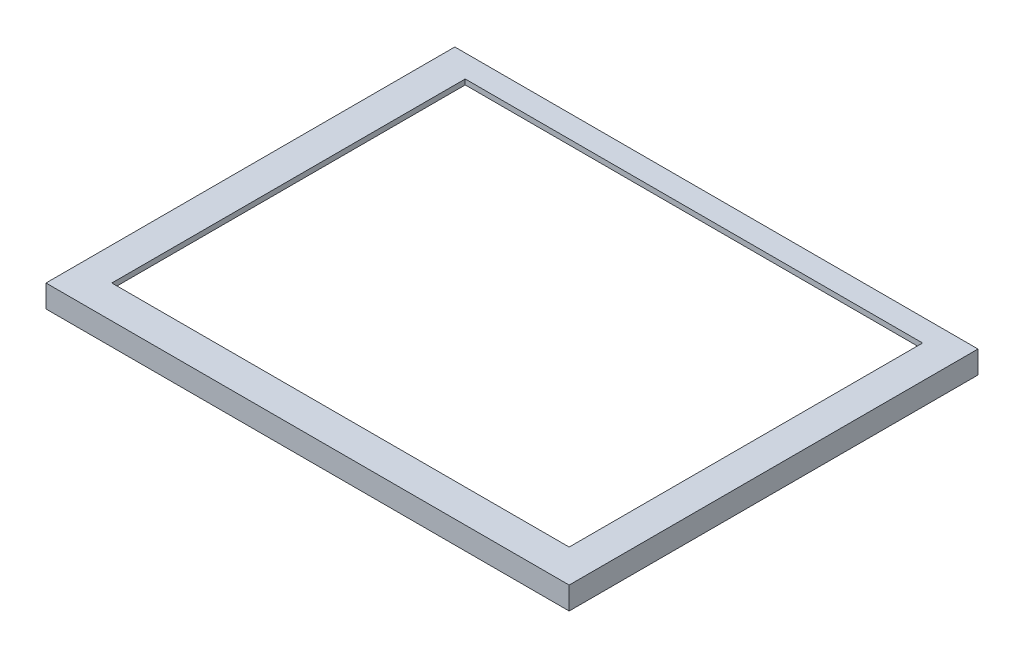
ISO-10303-21;
HEADER;
FILE_DESCRIPTION(('STEP AP214'),'2;1');
FILE_NAME('part.step','',(''),(''),'','','');
FILE_SCHEMA(('AUTOMOTIVE_DESIGN { 1 0 10303 214 1 1 1 1 }'));
ENDSEC;
DATA;
#1=APPLICATION_CONTEXT('core data for automotive mechanical design processes');
#2=APPLICATION_PROTOCOL_DEFINITION('international standard','automotive_design',2000,#1);
#3=PRODUCT_CONTEXT('',#1,'mechanical');
#4=PRODUCT('Part','Part','',(#3));
#5=PRODUCT_RELATED_PRODUCT_CATEGORY('part','',(#4));
#6=PRODUCT_DEFINITION_FORMATION('','',#4);
#7=PRODUCT_DEFINITION_CONTEXT('part definition',#1,'design');
#8=PRODUCT_DEFINITION('design','',#6,#7);
#9=PRODUCT_DEFINITION_SHAPE('','',#8);
#10=(LENGTH_UNIT() NAMED_UNIT(*) SI_UNIT(.MILLI.,.METRE.));
#11=(NAMED_UNIT(*) PLANE_ANGLE_UNIT() SI_UNIT($,.RADIAN.));
#12=(NAMED_UNIT(*) SI_UNIT($,.STERADIAN.) SOLID_ANGLE_UNIT());
#13=UNCERTAINTY_MEASURE_WITH_UNIT(LENGTH_MEASURE(1.E-05),#10,'distance_accuracy_value','');
#14=(GEOMETRIC_REPRESENTATION_CONTEXT(3) GLOBAL_UNCERTAINTY_ASSIGNED_CONTEXT((#13)) GLOBAL_UNIT_ASSIGNED_CONTEXT((#10,
#11,#12)) REPRESENTATION_CONTEXT('',''));
#15=CARTESIAN_POINT('',(0.,0.,0.));
#16=DIRECTION('',(0.,0.,1.));
#17=DIRECTION('',(1.,0.,0.));
#18=AXIS2_PLACEMENT_3D('',#15,#16,#17);
#19=CARTESIAN_POINT('',(0.,0.,0.));
#20=DIRECTION('',(0.,-1.,0.));
#21=DIRECTION('',(0.,0.,-1.));
#22=AXIS2_PLACEMENT_3D('',#19,#20,#21);
#23=PLANE('',#22);
#24=DIRECTION('',(0.,0.,1.));
#25=VECTOR('',#24,1.);
#26=CARTESIAN_POINT('',(-75.5,0.,59.));
#27=LINE('',#26,#25);
#28=CARTESIAN_POINT('',(-75.5,0.,-59.));
#29=VERTEX_POINT('',#28);
#30=CARTESIAN_POINT('',(-75.5,0.,59.));
#31=VERTEX_POINT('',#30);
#32=EDGE_CURVE('E208',#29,#31,#27,.T.);
#33=ORIENTED_EDGE('',*,*,#32,.F.);
#34=DIRECTION('',(-1.,0.,0.));
#35=VECTOR('',#34,1.);
#36=CARTESIAN_POINT('',(-75.5,0.,-59.));
#37=LINE('',#36,#35);
#38=CARTESIAN_POINT('',(75.5,0.,-59.));
#39=VERTEX_POINT('',#38);
#40=EDGE_CURVE('E55',#39,#29,#37,.T.);
#41=ORIENTED_EDGE('',*,*,#40,.F.);
#42=DIRECTION('',(0.,0.,-1.));
#43=VECTOR('',#42,1.);
#44=CARTESIAN_POINT('',(75.5,0.,59.));
#45=LINE('',#44,#43);
#46=CARTESIAN_POINT('',(75.5,0.,59.));
#47=VERTEX_POINT('',#46);
#48=EDGE_CURVE('E213',#47,#39,#45,.T.);
#49=ORIENTED_EDGE('',*,*,#48,.F.);
#50=DIRECTION('',(1.,0.,0.));
#51=VECTOR('',#50,1.);
#52=CARTESIAN_POINT('',(-75.5,0.,59.));
#53=LINE('',#52,#51);
#54=EDGE_CURVE('E211',#31,#47,#53,.T.);
#55=ORIENTED_EDGE('',*,*,#54,.F.);
#56=EDGE_LOOP('',(#33,#41,#49,#55));
#57=FACE_BOUND('',#56,.T.);
#58=DIRECTION('',(1.,0.,0.));
#59=VECTOR('',#58,1.);
#60=CARTESIAN_POINT('',(-74.,0.,57.5));
#61=LINE('',#60,#59);
#62=CARTESIAN_POINT('',(-74.,0.,57.5));
#63=VERTEX_POINT('',#62);
#64=CARTESIAN_POINT('',(74.,0.,57.5));
#65=VERTEX_POINT('',#64);
#66=EDGE_CURVE('E182',#63,#65,#61,.T.);
#67=ORIENTED_EDGE('',*,*,#66,.T.);
#68=DIRECTION('',(0.,0.,-1.));
#69=VECTOR('',#68,1.);
#70=CARTESIAN_POINT('',(74.,0.,57.5));
#71=LINE('',#70,#69);
#72=CARTESIAN_POINT('',(74.,0.,-57.5));
#73=VERTEX_POINT('',#72);
#74=EDGE_CURVE('E47',#65,#73,#71,.T.);
#75=ORIENTED_EDGE('',*,*,#74,.T.);
#76=DIRECTION('',(-1.,0.,0.));
#77=VECTOR('',#76,1.);
#78=CARTESIAN_POINT('',(-74.,0.,-57.5));
#79=LINE('',#78,#77);
#80=CARTESIAN_POINT('',(-74.,0.,-57.5));
#81=VERTEX_POINT('',#80);
#82=EDGE_CURVE('E193',#73,#81,#79,.T.);
#83=ORIENTED_EDGE('',*,*,#82,.T.);
#84=DIRECTION('',(0.,0.,1.));
#85=VECTOR('',#84,1.);
#86=CARTESIAN_POINT('',(-74.,0.,57.5));
#87=LINE('',#86,#85);
#88=EDGE_CURVE('E196',#81,#63,#87,.T.);
#89=ORIENTED_EDGE('',*,*,#88,.T.);
#90=EDGE_LOOP('',(#67,#75,#83,#89));
#91=FACE_BOUND('',#90,.T.);
#92=ADVANCED_FACE('F32',(#57,#91),#23,.T.);
#93=CARTESIAN_POINT('',(-75.5,5.,59.));
#94=DIRECTION('',(1.,0.,0.));
#95=DIRECTION('',(0.,0.,-1.));
#96=AXIS2_PLACEMENT_3D('',#93,#94,#95);
#97=PLANE('',#96);
#98=ORIENTED_EDGE('',*,*,#32,.T.);
#99=DIRECTION('',(0.,-1.,0.));
#100=VECTOR('',#99,1.);
#101=CARTESIAN_POINT('',(-75.5,5.,59.));
#102=LINE('',#101,#100);
#103=CARTESIAN_POINT('',(-75.5,6.5,59.));
#104=VERTEX_POINT('',#103);
#105=EDGE_CURVE('E11',#104,#31,#102,.T.);
#106=ORIENTED_EDGE('',*,*,#105,.F.);
#107=DIRECTION('',(0.,0.,1.));
#108=VECTOR('',#107,1.);
#109=CARTESIAN_POINT('',(-75.5,6.5,-59.));
#110=LINE('',#109,#108);
#111=CARTESIAN_POINT('',(-75.5,6.5,-59.));
#112=VERTEX_POINT('',#111);
#113=EDGE_CURVE('E143',#112,#104,#110,.T.);
#114=ORIENTED_EDGE('',*,*,#113,.F.);
#115=DIRECTION('',(0.,-1.,0.));
#116=VECTOR('',#115,1.);
#117=CARTESIAN_POINT('',(-75.5,5.,-59.));
#118=LINE('',#117,#116);
#119=EDGE_CURVE('E216',#112,#29,#118,.T.);
#120=ORIENTED_EDGE('',*,*,#119,.T.);
#121=EDGE_LOOP('',(#98,#106,#114,#120));
#122=FACE_BOUND('',#121,.T.);
#123=ADVANCED_FACE('F34',(#122),#97,.F.);
#124=CARTESIAN_POINT('',(-75.5,5.,59.));
#125=DIRECTION('',(0.,0.,-1.));
#126=DIRECTION('',(-1.,0.,0.));
#127=AXIS2_PLACEMENT_3D('',#124,#125,#126);
#128=PLANE('',#127);
#129=ORIENTED_EDGE('',*,*,#54,.T.);
#130=DIRECTION('',(0.,-1.,0.));
#131=VECTOR('',#130,1.);
#132=CARTESIAN_POINT('',(75.5,5.,59.));
#133=LINE('',#132,#131);
#134=CARTESIAN_POINT('',(75.5,6.5,59.));
#135=VERTEX_POINT('',#134);
#136=EDGE_CURVE('E40',#135,#47,#133,.T.);
#137=ORIENTED_EDGE('',*,*,#136,.F.);
#138=DIRECTION('',(1.,0.,0.));
#139=VECTOR('',#138,1.);
#140=CARTESIAN_POINT('',(-75.5,6.5,59.));
#141=LINE('',#140,#139);
#142=EDGE_CURVE('E169',#104,#135,#141,.T.);
#143=ORIENTED_EDGE('',*,*,#142,.F.);
#144=ORIENTED_EDGE('',*,*,#105,.T.);
#145=EDGE_LOOP('',(#129,#137,#143,#144));
#146=FACE_BOUND('',#145,.T.);
#147=ADVANCED_FACE('F234',(#146),#128,.F.);
#148=CARTESIAN_POINT('',(75.5,5.,59.));
#149=DIRECTION('',(-1.,0.,0.));
#150=DIRECTION('',(0.,0.,1.));
#151=AXIS2_PLACEMENT_3D('',#148,#149,#150);
#152=PLANE('',#151);
#153=ORIENTED_EDGE('',*,*,#48,.T.);
#154=DIRECTION('',(0.,-1.,0.));
#155=VECTOR('',#154,1.);
#156=CARTESIAN_POINT('',(75.5,5.,-59.));
#157=LINE('',#156,#155);
#158=CARTESIAN_POINT('',(75.5,6.5,-59.));
#159=VERTEX_POINT('',#158);
#160=EDGE_CURVE('E218',#159,#39,#157,.T.);
#161=ORIENTED_EDGE('',*,*,#160,.F.);
#162=DIRECTION('',(0.,0.,-1.));
#163=VECTOR('',#162,1.);
#164=CARTESIAN_POINT('',(75.5,6.5,-59.));
#165=LINE('',#164,#163);
#166=EDGE_CURVE('E172',#135,#159,#165,.T.);
#167=ORIENTED_EDGE('',*,*,#166,.F.);
#168=ORIENTED_EDGE('',*,*,#136,.T.);
#169=EDGE_LOOP('',(#153,#161,#167,#168));
#170=FACE_BOUND('',#169,.T.);
#171=ADVANCED_FACE('F223',(#170),#152,.F.);
#172=CARTESIAN_POINT('',(-75.5,5.,-59.));
#173=DIRECTION('',(0.,0.,1.));
#174=DIRECTION('',(1.,0.,0.));
#175=AXIS2_PLACEMENT_3D('',#172,#173,#174);
#176=PLANE('',#175);
#177=ORIENTED_EDGE('',*,*,#40,.T.);
#178=ORIENTED_EDGE('',*,*,#119,.F.);
#179=DIRECTION('',(-1.,0.,0.));
#180=VECTOR('',#179,1.);
#181=CARTESIAN_POINT('',(-75.5,6.5,-59.));
#182=LINE('',#181,#180);
#183=EDGE_CURVE('E175',#159,#112,#182,.T.);
#184=ORIENTED_EDGE('',*,*,#183,.F.);
#185=ORIENTED_EDGE('',*,*,#160,.T.);
#186=EDGE_LOOP('',(#177,#178,#184,#185));
#187=FACE_BOUND('',#186,.T.);
#188=ADVANCED_FACE('F232',(#187),#176,.F.);
#189=CARTESIAN_POINT('',(74.,5.,57.5));
#190=DIRECTION('',(-1.,0.,0.));
#191=DIRECTION('',(0.,0.,1.));
#192=AXIS2_PLACEMENT_3D('',#189,#190,#191);
#193=PLANE('',#192);
#194=ORIENTED_EDGE('',*,*,#74,.F.);
#195=DIRECTION('',(0.,-1.,0.));
#196=VECTOR('',#195,1.);
#197=CARTESIAN_POINT('',(74.,5.,57.5));
#198=LINE('',#197,#196);
#199=CARTESIAN_POINT('',(74.,5.,57.5));
#200=VERTEX_POINT('',#199);
#201=EDGE_CURVE('E191',#200,#65,#198,.T.);
#202=ORIENTED_EDGE('',*,*,#201,.F.);
#203=DIRECTION('',(0.,0.,-1.));
#204=VECTOR('',#203,1.);
#205=CARTESIAN_POINT('',(74.,5.,57.5));
#206=LINE('',#205,#204);
#207=CARTESIAN_POINT('',(74.,5.,-57.5));
#208=VERTEX_POINT('',#207);
#209=EDGE_CURVE('E178',#200,#208,#206,.T.);
#210=ORIENTED_EDGE('',*,*,#209,.T.);
#211=DIRECTION('',(0.,-1.,0.));
#212=VECTOR('',#211,1.);
#213=CARTESIAN_POINT('',(74.,5.,-57.5));
#214=LINE('',#213,#212);
#215=EDGE_CURVE('E206',#208,#73,#214,.T.);
#216=ORIENTED_EDGE('',*,*,#215,.T.);
#217=EDGE_LOOP('',(#194,#202,#210,#216));
#218=FACE_BOUND('',#217,.T.);
#219=ADVANCED_FACE('F247',(#218),#193,.T.);
#220=CARTESIAN_POINT('',(-74.,5.,-57.5));
#221=DIRECTION('',(0.,0.,1.));
#222=DIRECTION('',(1.,0.,0.));
#223=AXIS2_PLACEMENT_3D('',#220,#221,#222);
#224=PLANE('',#223);
#225=ORIENTED_EDGE('',*,*,#82,.F.);
#226=ORIENTED_EDGE('',*,*,#215,.F.);
#227=DIRECTION('',(-1.,0.,0.));
#228=VECTOR('',#227,1.);
#229=CARTESIAN_POINT('',(-74.,5.,-57.5));
#230=LINE('',#229,#228);
#231=CARTESIAN_POINT('',(-74.,5.,-57.5));
#232=VERTEX_POINT('',#231);
#233=EDGE_CURVE('E181',#208,#232,#230,.T.);
#234=ORIENTED_EDGE('',*,*,#233,.T.);
#235=DIRECTION('',(0.,-1.,0.));
#236=VECTOR('',#235,1.);
#237=CARTESIAN_POINT('',(-74.,5.,-57.5));
#238=LINE('',#237,#236);
#239=EDGE_CURVE('E204',#232,#81,#238,.T.);
#240=ORIENTED_EDGE('',*,*,#239,.T.);
#241=EDGE_LOOP('',(#225,#226,#234,#240));
#242=FACE_BOUND('',#241,.T.);
#243=ADVANCED_FACE('F253',(#242),#224,.T.);
#244=CARTESIAN_POINT('',(-74.,5.,57.5));
#245=DIRECTION('',(1.,0.,0.));
#246=DIRECTION('',(0.,0.,-1.));
#247=AXIS2_PLACEMENT_3D('',#244,#245,#246);
#248=PLANE('',#247);
#249=ORIENTED_EDGE('',*,*,#88,.F.);
#250=ORIENTED_EDGE('',*,*,#239,.F.);
#251=DIRECTION('',(0.,0.,1.));
#252=VECTOR('',#251,1.);
#253=CARTESIAN_POINT('',(-74.,5.,57.5));
#254=LINE('',#253,#252);
#255=CARTESIAN_POINT('',(-74.,5.,57.5));
#256=VERTEX_POINT('',#255);
#257=EDGE_CURVE('E185',#232,#256,#254,.T.);
#258=ORIENTED_EDGE('',*,*,#257,.T.);
#259=DIRECTION('',(0.,-1.,0.));
#260=VECTOR('',#259,1.);
#261=CARTESIAN_POINT('',(-74.,5.,57.5));
#262=LINE('',#261,#260);
#263=EDGE_CURVE('E202',#256,#63,#262,.T.);
#264=ORIENTED_EDGE('',*,*,#263,.T.);
#265=EDGE_LOOP('',(#249,#250,#258,#264));
#266=FACE_BOUND('',#265,.T.);
#267=ADVANCED_FACE('F257',(#266),#248,.T.);
#268=CARTESIAN_POINT('',(-74.,5.,57.5));
#269=DIRECTION('',(0.,0.,-1.));
#270=DIRECTION('',(-1.,0.,0.));
#271=AXIS2_PLACEMENT_3D('',#268,#269,#270);
#272=PLANE('',#271);
#273=ORIENTED_EDGE('',*,*,#66,.F.);
#274=ORIENTED_EDGE('',*,*,#263,.F.);
#275=DIRECTION('',(1.,0.,0.));
#276=VECTOR('',#275,1.);
#277=CARTESIAN_POINT('',(-74.,5.,57.5));
#278=LINE('',#277,#276);
#279=EDGE_CURVE('E188',#256,#200,#278,.T.);
#280=ORIENTED_EDGE('',*,*,#279,.T.);
#281=ORIENTED_EDGE('',*,*,#201,.T.);
#282=EDGE_LOOP('',(#273,#274,#280,#281));
#283=FACE_BOUND('',#282,.T.);
#284=ADVANCED_FACE('F262',(#283),#272,.T.);
#285=CARTESIAN_POINT('',(0.,6.5,0.));
#286=DIRECTION('',(0.,1.,0.));
#287=DIRECTION('',(0.,0.,1.));
#288=AXIS2_PLACEMENT_3D('',#285,#286,#287);
#289=PLANE('',#288);
#290=ORIENTED_EDGE('',*,*,#113,.T.);
#291=ORIENTED_EDGE('',*,*,#142,.T.);
#292=ORIENTED_EDGE('',*,*,#166,.T.);
#293=ORIENTED_EDGE('',*,*,#183,.T.);
#294=EDGE_LOOP('',(#290,#291,#292,#293));
#295=FACE_BOUND('',#294,.T.);
#296=DIRECTION('',(1.,0.,0.));
#297=VECTOR('',#296,1.);
#298=CARTESIAN_POINT('',(-66.,6.5,49.5));
#299=LINE('',#298,#297);
#300=CARTESIAN_POINT('',(-66.,6.5,49.5));
#301=VERTEX_POINT('',#300);
#302=CARTESIAN_POINT('',(66.,6.5,49.5));
#303=VERTEX_POINT('',#302);
#304=EDGE_CURVE('E135',#301,#303,#299,.T.);
#305=ORIENTED_EDGE('',*,*,#304,.F.);
#306=DIRECTION('',(0.,0.,1.));
#307=VECTOR('',#306,1.);
#308=CARTESIAN_POINT('',(-66.,6.5,-52.5));
#309=LINE('',#308,#307);
#310=CARTESIAN_POINT('',(-66.,6.5,-52.5));
#311=VERTEX_POINT('',#310);
#312=EDGE_CURVE('E125',#311,#301,#309,.T.);
#313=ORIENTED_EDGE('',*,*,#312,.F.);
#314=DIRECTION('',(-1.,0.,0.));
#315=VECTOR('',#314,1.);
#316=CARTESIAN_POINT('',(-66.,6.5,-52.5));
#317=LINE('',#316,#315);
#318=CARTESIAN_POINT('',(66.,6.5,-52.5));
#319=VERTEX_POINT('',#318);
#320=EDGE_CURVE('E151',#319,#311,#317,.T.);
#321=ORIENTED_EDGE('',*,*,#320,.F.);
#322=DIRECTION('',(0.,0.,-1.));
#323=VECTOR('',#322,1.);
#324=CARTESIAN_POINT('',(66.,6.5,-52.5));
#325=LINE('',#324,#323);
#326=EDGE_CURVE('E149',#303,#319,#325,.T.);
#327=ORIENTED_EDGE('',*,*,#326,.F.);
#328=EDGE_LOOP('',(#305,#313,#321,#327));
#329=FACE_BOUND('',#328,.T.);
#330=ADVANCED_FACE('F147',(#295,#329),#289,.T.);
#331=CARTESIAN_POINT('',(0.,5.,0.));
#332=DIRECTION('',(0.,1.,0.));
#333=DIRECTION('',(0.,0.,1.));
#334=AXIS2_PLACEMENT_3D('',#331,#332,#333);
#335=PLANE('',#334);
#336=ORIENTED_EDGE('',*,*,#209,.F.);
#337=ORIENTED_EDGE('',*,*,#279,.F.);
#338=ORIENTED_EDGE('',*,*,#257,.F.);
#339=ORIENTED_EDGE('',*,*,#233,.F.);
#340=EDGE_LOOP('',(#336,#337,#338,#339));
#341=FACE_BOUND('',#340,.T.);
#342=DIRECTION('',(0.,0.,1.));
#343=VECTOR('',#342,1.);
#344=CARTESIAN_POINT('',(-66.,5.,-52.5));
#345=LINE('',#344,#343);
#346=CARTESIAN_POINT('',(-66.,5.,-52.5));
#347=VERTEX_POINT('',#346);
#348=CARTESIAN_POINT('',(-66.,5.,49.5));
#349=VERTEX_POINT('',#348);
#350=EDGE_CURVE('E155',#347,#349,#345,.T.);
#351=ORIENTED_EDGE('',*,*,#350,.T.);
#352=DIRECTION('',(1.,0.,0.));
#353=VECTOR('',#352,1.);
#354=CARTESIAN_POINT('',(-66.,5.,49.5));
#355=LINE('',#354,#353);
#356=CARTESIAN_POINT('',(66.,5.,49.5));
#357=VERTEX_POINT('',#356);
#358=EDGE_CURVE('E142',#349,#357,#355,.T.);
#359=ORIENTED_EDGE('',*,*,#358,.T.);
#360=DIRECTION('',(0.,0.,-1.));
#361=VECTOR('',#360,1.);
#362=CARTESIAN_POINT('',(66.,5.,-52.5));
#363=LINE('',#362,#361);
#364=CARTESIAN_POINT('',(66.,5.,-52.5));
#365=VERTEX_POINT('',#364);
#366=EDGE_CURVE('E158',#357,#365,#363,.T.);
#367=ORIENTED_EDGE('',*,*,#366,.T.);
#368=DIRECTION('',(-1.,0.,0.));
#369=VECTOR('',#368,1.);
#370=CARTESIAN_POINT('',(-66.,5.,-52.5));
#371=LINE('',#370,#369);
#372=EDGE_CURVE('E136',#365,#347,#371,.T.);
#373=ORIENTED_EDGE('',*,*,#372,.T.);
#374=EDGE_LOOP('',(#351,#359,#367,#373));
#375=FACE_BOUND('',#374,.T.);
#376=ADVANCED_FACE('F269',(#341,#375),#335,.F.);
#377=CARTESIAN_POINT('',(-66.,6.5,-52.5));
#378=DIRECTION('',(1.,0.,0.));
#379=DIRECTION('',(0.,0.,-1.));
#380=AXIS2_PLACEMENT_3D('',#377,#378,#379);
#381=PLANE('',#380);
#382=ORIENTED_EDGE('',*,*,#350,.F.);
#383=DIRECTION('',(0.,-1.,0.));
#384=VECTOR('',#383,1.);
#385=CARTESIAN_POINT('',(-66.,6.5,-52.5));
#386=LINE('',#385,#384);
#387=EDGE_CURVE('E131',#311,#347,#386,.T.);
#388=ORIENTED_EDGE('',*,*,#387,.F.);
#389=ORIENTED_EDGE('',*,*,#312,.T.);
#390=DIRECTION('',(0.,-1.,0.));
#391=VECTOR('',#390,1.);
#392=CARTESIAN_POINT('',(-66.,6.5,49.5));
#393=LINE('',#392,#391);
#394=EDGE_CURVE('E128',#301,#349,#393,.T.);
#395=ORIENTED_EDGE('',*,*,#394,.T.);
#396=EDGE_LOOP('',(#382,#388,#389,#395));
#397=FACE_BOUND('',#396,.T.);
#398=ADVANCED_FACE('F127',(#397),#381,.T.);
#399=CARTESIAN_POINT('',(-66.,6.5,49.5));
#400=DIRECTION('',(0.,0.,-1.));
#401=DIRECTION('',(-1.,0.,0.));
#402=AXIS2_PLACEMENT_3D('',#399,#400,#401);
#403=PLANE('',#402);
#404=ORIENTED_EDGE('',*,*,#358,.F.);
#405=ORIENTED_EDGE('',*,*,#394,.F.);
#406=ORIENTED_EDGE('',*,*,#304,.T.);
#407=DIRECTION('',(0.,-1.,0.));
#408=VECTOR('',#407,1.);
#409=CARTESIAN_POINT('',(66.,6.5,49.5));
#410=LINE('',#409,#408);
#411=EDGE_CURVE('E144',#303,#357,#410,.T.);
#412=ORIENTED_EDGE('',*,*,#411,.T.);
#413=EDGE_LOOP('',(#404,#405,#406,#412));
#414=FACE_BOUND('',#413,.T.);
#415=ADVANCED_FACE('F139',(#414),#403,.T.);
#416=CARTESIAN_POINT('',(66.,6.5,-52.5));
#417=DIRECTION('',(-1.,0.,0.));
#418=DIRECTION('',(0.,0.,1.));
#419=AXIS2_PLACEMENT_3D('',#416,#417,#418);
#420=PLANE('',#419);
#421=ORIENTED_EDGE('',*,*,#366,.F.);
#422=ORIENTED_EDGE('',*,*,#411,.F.);
#423=ORIENTED_EDGE('',*,*,#326,.T.);
#424=DIRECTION('',(0.,-1.,0.));
#425=VECTOR('',#424,1.);
#426=CARTESIAN_POINT('',(66.,6.5,-52.5));
#427=LINE('',#426,#425);
#428=EDGE_CURVE('E164',#319,#365,#427,.T.);
#429=ORIENTED_EDGE('',*,*,#428,.T.);
#430=EDGE_LOOP('',(#421,#422,#423,#429));
#431=FACE_BOUND('',#430,.T.);
#432=ADVANCED_FACE('F279',(#431),#420,.T.);
#433=CARTESIAN_POINT('',(-66.,6.5,-52.5));
#434=DIRECTION('',(0.,0.,1.));
#435=DIRECTION('',(1.,0.,0.));
#436=AXIS2_PLACEMENT_3D('',#433,#434,#435);
#437=PLANE('',#436);
#438=ORIENTED_EDGE('',*,*,#372,.F.);
#439=ORIENTED_EDGE('',*,*,#428,.F.);
#440=ORIENTED_EDGE('',*,*,#320,.T.);
#441=ORIENTED_EDGE('',*,*,#387,.T.);
#442=EDGE_LOOP('',(#438,#439,#440,#441));
#443=FACE_BOUND('',#442,.T.);
#444=ADVANCED_FACE('F282',(#443),#437,.T.);
#445=CLOSED_SHELL('',(#92,#123,#147,#171,#188,#219,#243,#267,#284,#330,#376,#398,#415,#432,#444));
#446=MANIFOLD_SOLID_BREP('B2',#445);
#447=ADVANCED_BREP_SHAPE_REPRESENTATION('',(#18,#446),#14);
#448=SHAPE_DEFINITION_REPRESENTATION(#9,#447);
ENDSEC;
END-ISO-10303-21;
